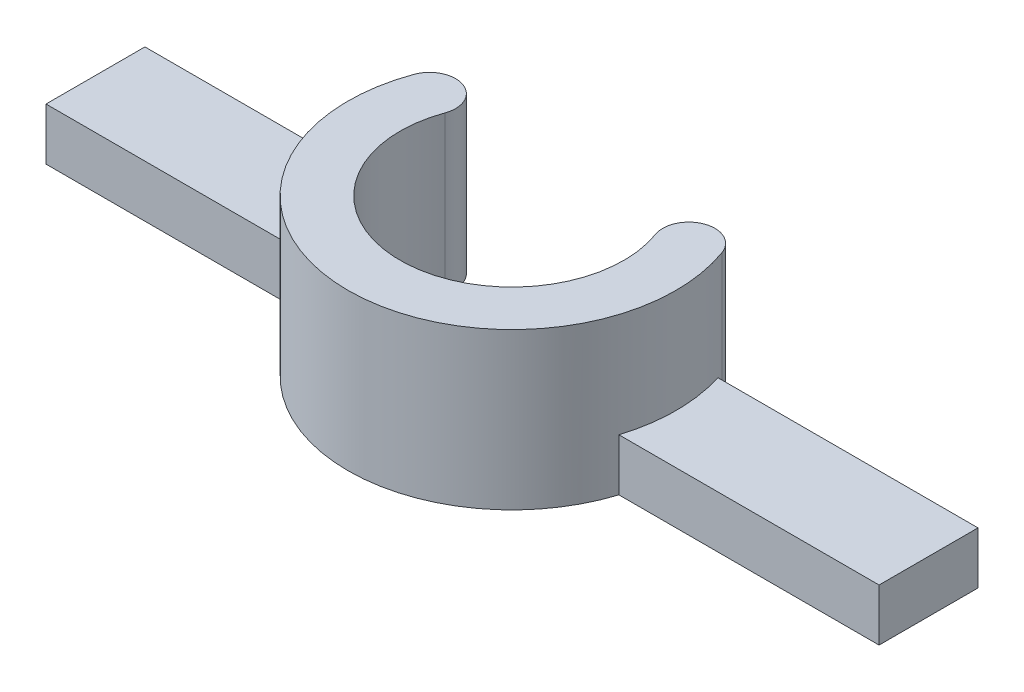
ISO-10303-21;
HEADER;
FILE_DESCRIPTION(('STEP AP214'),'2;1');
FILE_NAME('part.step','',(''),(''),'','','');
FILE_SCHEMA(('AUTOMOTIVE_DESIGN { 1 0 10303 214 1 1 1 1 }'));
ENDSEC;
DATA;
#1=APPLICATION_CONTEXT('core data for automotive mechanical design processes');
#2=APPLICATION_PROTOCOL_DEFINITION('international standard','automotive_design',2000,#1);
#3=PRODUCT_CONTEXT('',#1,'mechanical');
#4=PRODUCT('Part','Part','',(#3));
#5=PRODUCT_RELATED_PRODUCT_CATEGORY('part','',(#4));
#6=PRODUCT_DEFINITION_FORMATION('','',#4);
#7=PRODUCT_DEFINITION_CONTEXT('part definition',#1,'design');
#8=PRODUCT_DEFINITION('design','',#6,#7);
#9=PRODUCT_DEFINITION_SHAPE('','',#8);
#10=(LENGTH_UNIT() NAMED_UNIT(*) SI_UNIT(.MILLI.,.METRE.));
#11=(NAMED_UNIT(*) PLANE_ANGLE_UNIT() SI_UNIT($,.RADIAN.));
#12=(NAMED_UNIT(*) SI_UNIT($,.STERADIAN.) SOLID_ANGLE_UNIT());
#13=UNCERTAINTY_MEASURE_WITH_UNIT(LENGTH_MEASURE(1.E-05),#10,'distance_accuracy_value','');
#14=(GEOMETRIC_REPRESENTATION_CONTEXT(3) GLOBAL_UNCERTAINTY_ASSIGNED_CONTEXT((#13)) GLOBAL_UNIT_ASSIGNED_CONTEXT((#10,
#11,#12)) REPRESENTATION_CONTEXT('',''));
#15=CARTESIAN_POINT('',(0.,0.,0.));
#16=DIRECTION('',(0.,0.,1.));
#17=DIRECTION('',(1.,0.,0.));
#18=AXIS2_PLACEMENT_3D('',#15,#16,#17);
#19=CARTESIAN_POINT('',(0.,6.,0.));
#20=DIRECTION('',(0.,-1.,0.));
#21=DIRECTION('',(0.,0.,-1.));
#22=AXIS2_PLACEMENT_3D('',#19,#20,#21);
#23=CYLINDRICAL_SURFACE('',#22,6.3);
#24=DIRECTION('',(0.,-1.,0.));
#25=VECTOR('',#24,1.);
#26=CARTESIAN_POINT('',(6.00666296707248,6.,-1.9));
#27=LINE('',#26,#25);
#28=CARTESIAN_POINT('',(6.00666296707248,0.,-1.9));
#29=VERTEX_POINT('',#28);
#30=CARTESIAN_POINT('',(6.00666296707248,2.,-1.9));
#31=VERTEX_POINT('',#30);
#32=EDGE_CURVE('E145',#29,#31,#27,.F.);
#33=ORIENTED_EDGE('',*,*,#32,.F.);
#34=CARTESIAN_POINT('',(0.,0.,0.));
#35=DIRECTION('',(0.,1.,0.));
#36=DIRECTION('',(0.,0.,1.));
#37=AXIS2_PLACEMENT_3D('',#34,#35,#36);
#38=CIRCLE('',#37,6.3);
#39=CARTESIAN_POINT('',(5.92006351095122,0.,-2.15472690295172));
#40=VERTEX_POINT('',#39);
#41=EDGE_CURVE('E228',#29,#40,#38,.T.);
#42=ORIENTED_EDGE('',*,*,#41,.T.);
#43=DIRECTION('',(0.,-1.,0.));
#44=VECTOR('',#43,1.);
#45=CARTESIAN_POINT('',(5.92006351095122,6.,-2.15472690295172));
#46=LINE('',#45,#44);
#47=CARTESIAN_POINT('',(5.92006351095122,6.,-2.15472690295172));
#48=VERTEX_POINT('',#47);
#49=EDGE_CURVE('E245',#48,#40,#46,.T.);
#50=ORIENTED_EDGE('',*,*,#49,.F.);
#51=CARTESIAN_POINT('',(0.,6.,0.));
#52=DIRECTION('',(0.,1.,0.));
#53=DIRECTION('',(0.,0.,1.));
#54=AXIS2_PLACEMENT_3D('',#51,#52,#53);
#55=CIRCLE('',#54,6.3);
#56=CARTESIAN_POINT('',(-5.92006351095122,6.,-2.15472690295172));
#57=VERTEX_POINT('',#56);
#58=EDGE_CURVE('E213',#57,#48,#55,.T.);
#59=ORIENTED_EDGE('',*,*,#58,.F.);
#60=DIRECTION('',(0.,-1.,0.));
#61=VECTOR('',#60,1.);
#62=CARTESIAN_POINT('',(-5.92006351095122,6.,-2.15472690295172));
#63=LINE('',#62,#61);
#64=CARTESIAN_POINT('',(-5.92006351095122,0.,-2.15472690295172));
#65=VERTEX_POINT('',#64);
#66=EDGE_CURVE('E249',#57,#65,#63,.T.);
#67=ORIENTED_EDGE('',*,*,#66,.T.);
#68=CARTESIAN_POINT('',(-6.00666296707248,0.,-1.9));
#69=VERTEX_POINT('',#68);
#70=EDGE_CURVE('E229',#65,#69,#38,.T.);
#71=ORIENTED_EDGE('',*,*,#70,.T.);
#72=DIRECTION('',(0.,-1.,0.));
#73=VECTOR('',#72,1.);
#74=CARTESIAN_POINT('',(-6.00666296707248,6.,-1.9));
#75=LINE('',#74,#73);
#76=CARTESIAN_POINT('',(-6.00666296707248,2.,-1.9));
#77=VERTEX_POINT('',#76);
#78=EDGE_CURVE('E205',#69,#77,#75,.F.);
#79=ORIENTED_EDGE('',*,*,#78,.T.);
#80=CARTESIAN_POINT('',(0.,2.,0.));
#81=DIRECTION('',(0.,1.,0.));
#82=DIRECTION('',(0.,0.,1.));
#83=AXIS2_PLACEMENT_3D('',#80,#81,#82);
#84=CIRCLE('',#83,6.3);
#85=CARTESIAN_POINT('',(-6.00666296707248,2.,1.9));
#86=VERTEX_POINT('',#85);
#87=EDGE_CURVE('E50',#77,#86,#84,.T.);
#88=ORIENTED_EDGE('',*,*,#87,.T.);
#89=DIRECTION('',(0.,-1.,0.));
#90=VECTOR('',#89,1.);
#91=CARTESIAN_POINT('',(-6.00666296707248,6.,1.9));
#92=LINE('',#91,#90);
#93=CARTESIAN_POINT('',(-6.00666296707248,0.,1.9));
#94=VERTEX_POINT('',#93);
#95=EDGE_CURVE('E201',#94,#86,#92,.F.);
#96=ORIENTED_EDGE('',*,*,#95,.F.);
#97=CARTESIAN_POINT('',(6.00666296707248,0.,1.9));
#98=VERTEX_POINT('',#97);
#99=EDGE_CURVE('E233',#94,#98,#38,.T.);
#100=ORIENTED_EDGE('',*,*,#99,.T.);
#101=DIRECTION('',(0.,-1.,0.));
#102=VECTOR('',#101,1.);
#103=CARTESIAN_POINT('',(6.00666296707248,6.,1.9));
#104=LINE('',#103,#102);
#105=CARTESIAN_POINT('',(6.00666296707248,2.,1.9));
#106=VERTEX_POINT('',#105);
#107=EDGE_CURVE('E60',#98,#106,#104,.F.);
#108=ORIENTED_EDGE('',*,*,#107,.T.);
#109=CARTESIAN_POINT('',(0.,2.,0.));
#110=DIRECTION('',(0.,1.,0.));
#111=DIRECTION('',(0.,0.,1.));
#112=AXIS2_PLACEMENT_3D('',#109,#110,#111);
#113=CIRCLE('',#112,6.3);
#114=EDGE_CURVE('E11',#106,#31,#113,.T.);
#115=ORIENTED_EDGE('',*,*,#114,.T.);
#116=EDGE_LOOP('',(#33,#42,#50,#59,#67,#71,#79,#88,#96,#100,#108,#115));
#117=FACE_BOUND('',#116,.T.);
#118=ADVANCED_FACE('F41',(#117),#23,.T.);
#119=CARTESIAN_POINT('',(-4.98037089016531,6.,-1.81270675962605));
#120=DIRECTION('',(0.,-1.,0.));
#121=DIRECTION('',(0.,0.,-1.));
#122=AXIS2_PLACEMENT_3D('',#119,#120,#121);
#123=CYLINDRICAL_SURFACE('',#122,1.);
#124=CARTESIAN_POINT('',(-4.98037089016531,0.,-1.81270675962605));
#125=DIRECTION('',(0.,1.,0.));
#126=DIRECTION('',(0.,0.,1.));
#127=AXIS2_PLACEMENT_3D('',#124,#125,#126);
#128=CIRCLE('',#127,1.);
#129=CARTESIAN_POINT('',(-4.0406782693794,0.,-1.47068661630038));
#130=VERTEX_POINT('',#129);
#131=EDGE_CURVE('E208',#65,#130,#128,.F.);
#132=ORIENTED_EDGE('',*,*,#131,.F.);
#133=ORIENTED_EDGE('',*,*,#66,.F.);
#134=CARTESIAN_POINT('',(-4.98037089016531,6.,-1.81270675962605));
#135=DIRECTION('',(0.,1.,0.));
#136=DIRECTION('',(0.,0.,1.));
#137=AXIS2_PLACEMENT_3D('',#134,#135,#136);
#138=CIRCLE('',#137,1.);
#139=CARTESIAN_POINT('',(-4.0406782693794,6.,-1.47068661630038));
#140=VERTEX_POINT('',#139);
#141=EDGE_CURVE('E209',#57,#140,#138,.F.);
#142=ORIENTED_EDGE('',*,*,#141,.T.);
#143=DIRECTION('',(0.,-1.,0.));
#144=VECTOR('',#143,1.);
#145=CARTESIAN_POINT('',(-4.0406782693794,6.,-1.47068661630038));
#146=LINE('',#145,#144);
#147=EDGE_CURVE('E224',#140,#130,#146,.T.);
#148=ORIENTED_EDGE('',*,*,#147,.T.);
#149=EDGE_LOOP('',(#132,#133,#142,#148));
#150=FACE_BOUND('',#149,.T.);
#151=ADVANCED_FACE('F43',(#150),#123,.T.);
#152=CARTESIAN_POINT('',(4.98037089016531,6.,-1.81270675962605));
#153=DIRECTION('',(0.,-1.,0.));
#154=DIRECTION('',(0.,0.,-1.));
#155=AXIS2_PLACEMENT_3D('',#152,#153,#154);
#156=CYLINDRICAL_SURFACE('',#155,1.);
#157=CARTESIAN_POINT('',(4.98037089016531,0.,-1.81270675962605));
#158=DIRECTION('',(0.,1.,0.));
#159=DIRECTION('',(0.,0.,1.));
#160=AXIS2_PLACEMENT_3D('',#157,#158,#159);
#161=CIRCLE('',#160,1.);
#162=CARTESIAN_POINT('',(4.0406782693794,0.,-1.47068661630038));
#163=VERTEX_POINT('',#162);
#164=EDGE_CURVE('E232',#40,#163,#161,.T.);
#165=ORIENTED_EDGE('',*,*,#164,.T.);
#166=DIRECTION('',(0.,-1.,0.));
#167=VECTOR('',#166,1.);
#168=CARTESIAN_POINT('',(4.0406782693794,6.,-1.47068661630038));
#169=LINE('',#168,#167);
#170=CARTESIAN_POINT('',(4.0406782693794,6.,-1.47068661630038));
#171=VERTEX_POINT('',#170);
#172=EDGE_CURVE('E242',#171,#163,#169,.T.);
#173=ORIENTED_EDGE('',*,*,#172,.F.);
#174=CARTESIAN_POINT('',(4.98037089016531,6.,-1.81270675962605));
#175=DIRECTION('',(0.,1.,0.));
#176=DIRECTION('',(0.,0.,1.));
#177=AXIS2_PLACEMENT_3D('',#174,#175,#176);
#178=CIRCLE('',#177,1.);
#179=EDGE_CURVE('E217',#48,#171,#178,.T.);
#180=ORIENTED_EDGE('',*,*,#179,.F.);
#181=ORIENTED_EDGE('',*,*,#49,.T.);
#182=EDGE_LOOP('',(#165,#173,#180,#181));
#183=FACE_BOUND('',#182,.T.);
#184=ADVANCED_FACE('F278',(#183),#156,.T.);
#185=CARTESIAN_POINT('',(0.,6.,0.));
#186=DIRECTION('',(0.,-1.,0.));
#187=DIRECTION('',(0.,0.,-1.));
#188=AXIS2_PLACEMENT_3D('',#185,#186,#187);
#189=CYLINDRICAL_SURFACE('',#188,4.3);
#190=CARTESIAN_POINT('',(0.,0.,0.));
#191=DIRECTION('',(0.,1.,0.));
#192=DIRECTION('',(0.,0.,1.));
#193=AXIS2_PLACEMENT_3D('',#190,#191,#192);
#194=CIRCLE('',#193,4.3);
#195=EDGE_CURVE('E214',#130,#163,#194,.T.);
#196=ORIENTED_EDGE('',*,*,#195,.F.);
#197=ORIENTED_EDGE('',*,*,#147,.F.);
#198=CARTESIAN_POINT('',(0.,6.,0.));
#199=DIRECTION('',(0.,1.,0.));
#200=DIRECTION('',(0.,0.,1.));
#201=AXIS2_PLACEMENT_3D('',#198,#199,#200);
#202=CIRCLE('',#201,4.3);
#203=EDGE_CURVE('E220',#140,#171,#202,.T.);
#204=ORIENTED_EDGE('',*,*,#203,.T.);
#205=ORIENTED_EDGE('',*,*,#172,.T.);
#206=EDGE_LOOP('',(#196,#197,#204,#205));
#207=FACE_BOUND('',#206,.T.);
#208=ADVANCED_FACE('F284',(#207),#189,.F.);
#209=CARTESIAN_POINT('',(0.,6.,0.));
#210=DIRECTION('',(0.,1.,0.));
#211=DIRECTION('',(0.,0.,1.));
#212=AXIS2_PLACEMENT_3D('',#209,#210,#211);
#213=PLANE('',#212);
#214=ORIENTED_EDGE('',*,*,#141,.F.);
#215=ORIENTED_EDGE('',*,*,#58,.T.);
#216=ORIENTED_EDGE('',*,*,#179,.T.);
#217=ORIENTED_EDGE('',*,*,#203,.F.);
#218=EDGE_LOOP('',(#214,#215,#216,#217));
#219=FACE_BOUND('',#218,.T.);
#220=ADVANCED_FACE('F288',(#219),#213,.T.);
#221=CARTESIAN_POINT('',(0.,0.,0.));
#222=DIRECTION('',(0.,1.,0.));
#223=DIRECTION('',(0.,0.,1.));
#224=AXIS2_PLACEMENT_3D('',#221,#222,#223);
#225=PLANE('',#224);
#226=ORIENTED_EDGE('',*,*,#41,.F.);
#227=DIRECTION('',(-1.,0.,0.));
#228=VECTOR('',#227,1.);
#229=CARTESIAN_POINT('',(0.,0.,-1.9));
#230=LINE('',#229,#228);
#231=CARTESIAN_POINT('',(16.,0.,-1.9));
#232=VERTEX_POINT('',#231);
#233=EDGE_CURVE('E157',#232,#29,#230,.T.);
#234=ORIENTED_EDGE('',*,*,#233,.F.);
#235=DIRECTION('',(0.,0.,1.));
#236=VECTOR('',#235,1.);
#237=CARTESIAN_POINT('',(16.,0.,0.));
#238=LINE('',#237,#236);
#239=CARTESIAN_POINT('',(16.,0.,1.9));
#240=VERTEX_POINT('',#239);
#241=EDGE_CURVE('E135',#232,#240,#238,.T.);
#242=ORIENTED_EDGE('',*,*,#241,.T.);
#243=DIRECTION('',(-1.,0.,0.));
#244=VECTOR('',#243,1.);
#245=CARTESIAN_POINT('',(0.,0.,1.9));
#246=LINE('',#245,#244);
#247=EDGE_CURVE('E153',#240,#98,#246,.T.);
#248=ORIENTED_EDGE('',*,*,#247,.T.);
#249=ORIENTED_EDGE('',*,*,#99,.F.);
#250=DIRECTION('',(1.,0.,0.));
#251=VECTOR('',#250,1.);
#252=CARTESIAN_POINT('',(0.,0.,1.9));
#253=LINE('',#252,#251);
#254=CARTESIAN_POINT('',(-16.,0.,1.9));
#255=VERTEX_POINT('',#254);
#256=EDGE_CURVE('E178',#255,#94,#253,.T.);
#257=ORIENTED_EDGE('',*,*,#256,.F.);
#258=DIRECTION('',(0.,0.,1.));
#259=VECTOR('',#258,1.);
#260=CARTESIAN_POINT('',(-16.,0.,0.));
#261=LINE('',#260,#259);
#262=CARTESIAN_POINT('',(-16.,0.,-1.9));
#263=VERTEX_POINT('',#262);
#264=EDGE_CURVE('E189',#263,#255,#261,.T.);
#265=ORIENTED_EDGE('',*,*,#264,.F.);
#266=DIRECTION('',(1.,0.,0.));
#267=VECTOR('',#266,1.);
#268=CARTESIAN_POINT('',(0.,0.,-1.9));
#269=LINE('',#268,#267);
#270=EDGE_CURVE('E172',#263,#69,#269,.T.);
#271=ORIENTED_EDGE('',*,*,#270,.T.);
#272=ORIENTED_EDGE('',*,*,#70,.F.);
#273=ORIENTED_EDGE('',*,*,#131,.T.);
#274=ORIENTED_EDGE('',*,*,#195,.T.);
#275=ORIENTED_EDGE('',*,*,#164,.F.);
#276=EDGE_LOOP('',(#226,#234,#242,#248,#249,#257,#265,#271,#272,#273,#274,#275));
#277=FACE_BOUND('',#276,.T.);
#278=ADVANCED_FACE('F268',(#277),#225,.F.);
#279=CARTESIAN_POINT('',(0.,2.,-1.9));
#280=DIRECTION('',(0.,0.,-1.));
#281=DIRECTION('',(-1.,0.,0.));
#282=AXIS2_PLACEMENT_3D('',#279,#280,#281);
#283=PLANE('',#282);
#284=ORIENTED_EDGE('',*,*,#78,.F.);
#285=ORIENTED_EDGE('',*,*,#270,.F.);
#286=DIRECTION('',(0.,-1.,0.));
#287=VECTOR('',#286,1.);
#288=CARTESIAN_POINT('',(-16.,2.,-1.9));
#289=LINE('',#288,#287);
#290=CARTESIAN_POINT('',(-16.,2.,-1.9));
#291=VERTEX_POINT('',#290);
#292=EDGE_CURVE('E198',#291,#263,#289,.T.);
#293=ORIENTED_EDGE('',*,*,#292,.F.);
#294=DIRECTION('',(1.,0.,0.));
#295=VECTOR('',#294,1.);
#296=CARTESIAN_POINT('',(0.,2.,-1.9));
#297=LINE('',#296,#295);
#298=EDGE_CURVE('E173',#291,#77,#297,.T.);
#299=ORIENTED_EDGE('',*,*,#298,.T.);
#300=EDGE_LOOP('',(#284,#285,#293,#299));
#301=FACE_BOUND('',#300,.T.);
#302=ADVANCED_FACE('F303',(#301),#283,.T.);
#303=CARTESIAN_POINT('',(0.,2.,1.9));
#304=DIRECTION('',(0.,0.,-1.));
#305=DIRECTION('',(-1.,0.,0.));
#306=AXIS2_PLACEMENT_3D('',#303,#304,#305);
#307=PLANE('',#306);
#308=ORIENTED_EDGE('',*,*,#256,.T.);
#309=ORIENTED_EDGE('',*,*,#95,.T.);
#310=DIRECTION('',(1.,0.,0.));
#311=VECTOR('',#310,1.);
#312=CARTESIAN_POINT('',(0.,2.,1.9));
#313=LINE('',#312,#311);
#314=CARTESIAN_POINT('',(-16.,2.,1.9));
#315=VERTEX_POINT('',#314);
#316=EDGE_CURVE('E181',#315,#86,#313,.T.);
#317=ORIENTED_EDGE('',*,*,#316,.F.);
#318=DIRECTION('',(0.,-1.,0.));
#319=VECTOR('',#318,1.);
#320=CARTESIAN_POINT('',(-16.,2.,1.9));
#321=LINE('',#320,#319);
#322=EDGE_CURVE('E185',#315,#255,#321,.T.);
#323=ORIENTED_EDGE('',*,*,#322,.T.);
#324=EDGE_LOOP('',(#308,#309,#317,#323));
#325=FACE_BOUND('',#324,.T.);
#326=ADVANCED_FACE('F259',(#325),#307,.F.);
#327=CARTESIAN_POINT('',(-16.,2.,0.));
#328=DIRECTION('',(1.,0.,0.));
#329=DIRECTION('',(0.,0.,-1.));
#330=AXIS2_PLACEMENT_3D('',#327,#328,#329);
#331=PLANE('',#330);
#332=ORIENTED_EDGE('',*,*,#264,.T.);
#333=ORIENTED_EDGE('',*,*,#322,.F.);
#334=DIRECTION('',(0.,0.,1.));
#335=VECTOR('',#334,1.);
#336=CARTESIAN_POINT('',(-16.,2.,0.));
#337=LINE('',#336,#335);
#338=EDGE_CURVE('E177',#291,#315,#337,.T.);
#339=ORIENTED_EDGE('',*,*,#338,.F.);
#340=ORIENTED_EDGE('',*,*,#292,.T.);
#341=EDGE_LOOP('',(#332,#333,#339,#340));
#342=FACE_BOUND('',#341,.T.);
#343=ADVANCED_FACE('F265',(#342),#331,.F.);
#344=CARTESIAN_POINT('',(0.,2.,0.));
#345=DIRECTION('',(0.,1.,0.));
#346=DIRECTION('',(0.,0.,1.));
#347=AXIS2_PLACEMENT_3D('',#344,#345,#346);
#348=PLANE('',#347);
#349=ORIENTED_EDGE('',*,*,#87,.F.);
#350=ORIENTED_EDGE('',*,*,#298,.F.);
#351=ORIENTED_EDGE('',*,*,#338,.T.);
#352=ORIENTED_EDGE('',*,*,#316,.T.);
#353=EDGE_LOOP('',(#349,#350,#351,#352));
#354=FACE_BOUND('',#353,.T.);
#355=ADVANCED_FACE('F261',(#354),#348,.T.);
#356=CARTESIAN_POINT('',(0.,2.,-1.9));
#357=DIRECTION('',(0.,0.,1.));
#358=DIRECTION('',(1.,0.,0.));
#359=AXIS2_PLACEMENT_3D('',#356,#357,#358);
#360=PLANE('',#359);
#361=ORIENTED_EDGE('',*,*,#233,.T.);
#362=ORIENTED_EDGE('',*,*,#32,.T.);
#363=DIRECTION('',(-1.,0.,0.));
#364=VECTOR('',#363,1.);
#365=CARTESIAN_POINT('',(0.,2.,-1.9));
#366=LINE('',#365,#364);
#367=CARTESIAN_POINT('',(16.,2.,-1.9));
#368=VERTEX_POINT('',#367);
#369=EDGE_CURVE('E143',#368,#31,#366,.T.);
#370=ORIENTED_EDGE('',*,*,#369,.F.);
#371=DIRECTION('',(0.,-1.,0.));
#372=VECTOR('',#371,1.);
#373=CARTESIAN_POINT('',(16.,2.,-1.9));
#374=LINE('',#373,#372);
#375=EDGE_CURVE('E128',#368,#232,#374,.T.);
#376=ORIENTED_EDGE('',*,*,#375,.T.);
#377=EDGE_LOOP('',(#361,#362,#370,#376));
#378=FACE_BOUND('',#377,.T.);
#379=ADVANCED_FACE('F144',(#378),#360,.F.);
#380=CARTESIAN_POINT('',(0.,2.,1.9));
#381=DIRECTION('',(0.,0.,1.));
#382=DIRECTION('',(1.,0.,0.));
#383=AXIS2_PLACEMENT_3D('',#380,#381,#382);
#384=PLANE('',#383);
#385=ORIENTED_EDGE('',*,*,#107,.F.);
#386=ORIENTED_EDGE('',*,*,#247,.F.);
#387=DIRECTION('',(0.,-1.,0.));
#388=VECTOR('',#387,1.);
#389=CARTESIAN_POINT('',(16.,2.,1.9));
#390=LINE('',#389,#388);
#391=CARTESIAN_POINT('',(16.,2.,1.9));
#392=VERTEX_POINT('',#391);
#393=EDGE_CURVE('E140',#392,#240,#390,.T.);
#394=ORIENTED_EDGE('',*,*,#393,.F.);
#395=DIRECTION('',(-1.,0.,0.));
#396=VECTOR('',#395,1.);
#397=CARTESIAN_POINT('',(0.,2.,1.9));
#398=LINE('',#397,#396);
#399=EDGE_CURVE('E148',#392,#106,#398,.T.);
#400=ORIENTED_EDGE('',*,*,#399,.T.);
#401=EDGE_LOOP('',(#385,#386,#394,#400));
#402=FACE_BOUND('',#401,.T.);
#403=ADVANCED_FACE('F317',(#402),#384,.T.);
#404=CARTESIAN_POINT('',(16.,2.,0.));
#405=DIRECTION('',(1.,0.,0.));
#406=DIRECTION('',(0.,0.,-1.));
#407=AXIS2_PLACEMENT_3D('',#404,#405,#406);
#408=PLANE('',#407);
#409=ORIENTED_EDGE('',*,*,#241,.F.);
#410=ORIENTED_EDGE('',*,*,#375,.F.);
#411=DIRECTION('',(0.,0.,1.));
#412=VECTOR('',#411,1.);
#413=CARTESIAN_POINT('',(16.,2.,0.));
#414=LINE('',#413,#412);
#415=EDGE_CURVE('E132',#368,#392,#414,.T.);
#416=ORIENTED_EDGE('',*,*,#415,.T.);
#417=ORIENTED_EDGE('',*,*,#393,.T.);
#418=EDGE_LOOP('',(#409,#410,#416,#417));
#419=FACE_BOUND('',#418,.T.);
#420=ADVANCED_FACE('F130',(#419),#408,.T.);
#421=CARTESIAN_POINT('',(0.,2.,0.));
#422=DIRECTION('',(0.,1.,0.));
#423=DIRECTION('',(0.,0.,1.));
#424=AXIS2_PLACEMENT_3D('',#421,#422,#423);
#425=PLANE('',#424);
#426=ORIENTED_EDGE('',*,*,#114,.F.);
#427=ORIENTED_EDGE('',*,*,#399,.F.);
#428=ORIENTED_EDGE('',*,*,#415,.F.);
#429=ORIENTED_EDGE('',*,*,#369,.T.);
#430=EDGE_LOOP('',(#426,#427,#428,#429));
#431=FACE_BOUND('',#430,.T.);
#432=ADVANCED_FACE('F150',(#431),#425,.T.);
#433=CLOSED_SHELL('',(#118,#151,#184,#208,#220,#278,#302,#326,#343,#355,#379,#403,#420,#432));
#434=MANIFOLD_SOLID_BREP('B2',#433);
#435=ADVANCED_BREP_SHAPE_REPRESENTATION('',(#18,#434),#14);
#436=SHAPE_DEFINITION_REPRESENTATION(#9,#435);
ENDSEC;
END-ISO-10303-21;
